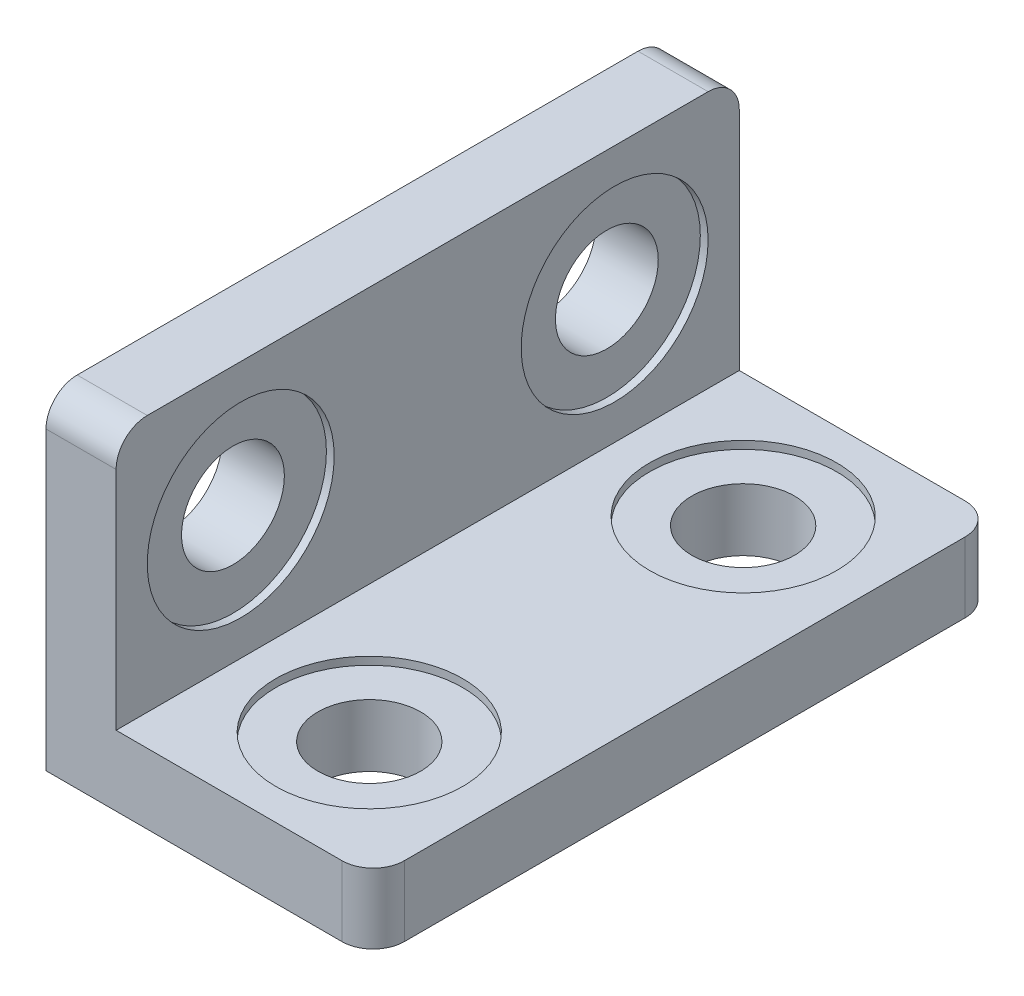
ISO-10303-21;
HEADER;
FILE_DESCRIPTION(('STEP AP214'),'2;1');
FILE_NAME('part.step','',(''),(''),'','','');
FILE_SCHEMA(('AUTOMOTIVE_DESIGN { 1 0 10303 214 1 1 1 1 }'));
ENDSEC;
DATA;
#1=APPLICATION_CONTEXT('core data for automotive mechanical design processes');
#2=APPLICATION_PROTOCOL_DEFINITION('international standard','automotive_design',2000,#1);
#3=PRODUCT_CONTEXT('',#1,'mechanical');
#4=PRODUCT('Part','Part','',(#3));
#5=PRODUCT_RELATED_PRODUCT_CATEGORY('part','',(#4));
#6=PRODUCT_DEFINITION_FORMATION('','',#4);
#7=PRODUCT_DEFINITION_CONTEXT('part definition',#1,'design');
#8=PRODUCT_DEFINITION('design','',#6,#7);
#9=PRODUCT_DEFINITION_SHAPE('','',#8);
#10=(LENGTH_UNIT() NAMED_UNIT(*) SI_UNIT(.MILLI.,.METRE.));
#11=(NAMED_UNIT(*) PLANE_ANGLE_UNIT() SI_UNIT($,.RADIAN.));
#12=(NAMED_UNIT(*) SI_UNIT($,.STERADIAN.) SOLID_ANGLE_UNIT());
#13=UNCERTAINTY_MEASURE_WITH_UNIT(LENGTH_MEASURE(1.E-05),#10,'distance_accuracy_value','');
#14=(GEOMETRIC_REPRESENTATION_CONTEXT(3) GLOBAL_UNCERTAINTY_ASSIGNED_CONTEXT((#13)) GLOBAL_UNIT_ASSIGNED_CONTEXT((#10,
#11,#12)) REPRESENTATION_CONTEXT('',''));
#15=CARTESIAN_POINT('',(0.,0.,0.));
#16=DIRECTION('',(0.,0.,1.));
#17=DIRECTION('',(1.,0.,0.));
#18=AXIS2_PLACEMENT_3D('',#15,#16,#17);
#19=CARTESIAN_POINT('',(4.5,21.,20.));
#20=DIRECTION('',(0.,-1.,0.));
#21=DIRECTION('',(0.,0.,-1.));
#22=AXIS2_PLACEMENT_3D('',#19,#20,#21);
#23=PLANE('',#22);
#24=DIRECTION('',(0.,0.,-1.));
#25=VECTOR('',#24,1.);
#26=CARTESIAN_POINT('',(0.,21.,20.));
#27=LINE('',#26,#25);
#28=CARTESIAN_POINT('',(0.,21.,18.));
#29=VERTEX_POINT('',#28);
#30=CARTESIAN_POINT('',(0.,21.,-18.));
#31=VERTEX_POINT('',#30);
#32=EDGE_CURVE('E134',#29,#31,#27,.T.);
#33=ORIENTED_EDGE('',*,*,#32,.F.);
#34=DIRECTION('',(-1.,0.,0.));
#35=VECTOR('',#34,1.);
#36=CARTESIAN_POINT('',(4.5,21.,18.));
#37=LINE('',#36,#35);
#38=CARTESIAN_POINT('',(4.5,21.,18.));
#39=VERTEX_POINT('',#38);
#40=EDGE_CURVE('E177',#29,#39,#37,.F.);
#41=ORIENTED_EDGE('',*,*,#40,.T.);
#42=DIRECTION('',(0.,0.,-1.));
#43=VECTOR('',#42,1.);
#44=CARTESIAN_POINT('',(4.5,21.,20.));
#45=LINE('',#44,#43);
#46=CARTESIAN_POINT('',(4.5,21.,-18.));
#47=VERTEX_POINT('',#46);
#48=EDGE_CURVE('E147',#39,#47,#45,.T.);
#49=ORIENTED_EDGE('',*,*,#48,.T.);
#50=DIRECTION('',(-1.,0.,0.));
#51=VECTOR('',#50,1.);
#52=CARTESIAN_POINT('',(4.5,21.,-18.));
#53=LINE('',#52,#51);
#54=EDGE_CURVE('E174',#47,#31,#53,.T.);
#55=ORIENTED_EDGE('',*,*,#54,.T.);
#56=EDGE_LOOP('',(#33,#41,#49,#55));
#57=FACE_BOUND('',#56,.T.);
#58=ADVANCED_FACE('F37',(#57),#23,.F.);
#59=CARTESIAN_POINT('',(0.,21.,20.));
#60=DIRECTION('',(1.,0.,0.));
#61=DIRECTION('',(0.,1.,0.));
#62=AXIS2_PLACEMENT_3D('',#59,#60,#61);
#63=PLANE('',#62);
#64=CARTESIAN_POINT('',(0.,12.75,-12.));
#65=DIRECTION('',(1.,0.,0.));
#66=DIRECTION('',(0.,0.,-1.));
#67=AXIS2_PLACEMENT_3D('',#64,#65,#66);
#68=CIRCLE('',#67,3.3);
#69=CARTESIAN_POINT('',(0.,12.75,-15.3));
#70=VERTEX_POINT('',#69);
#71=EDGE_CURVE('E314',#70,#70,#68,.T.);
#72=ORIENTED_EDGE('',*,*,#71,.T.);
#73=EDGE_LOOP('',(#72));
#74=FACE_BOUND('',#73,.T.);
#75=CARTESIAN_POINT('',(0.,12.75,12.));
#76=DIRECTION('',(1.,0.,0.));
#77=DIRECTION('',(0.,0.,-1.));
#78=AXIS2_PLACEMENT_3D('',#75,#76,#77);
#79=CIRCLE('',#78,3.3);
#80=CARTESIAN_POINT('',(0.,12.75,8.7));
#81=VERTEX_POINT('',#80);
#82=EDGE_CURVE('E326',#81,#81,#79,.T.);
#83=ORIENTED_EDGE('',*,*,#82,.T.);
#84=EDGE_LOOP('',(#83));
#85=FACE_BOUND('',#84,.T.);
#86=DIRECTION('',(0.,-1.,0.));
#87=VECTOR('',#86,1.);
#88=CARTESIAN_POINT('',(0.,21.,20.));
#89=LINE('',#88,#87);
#90=CARTESIAN_POINT('',(0.,19.,20.));
#91=VERTEX_POINT('',#90);
#92=CARTESIAN_POINT('',(0.,0.,20.));
#93=VERTEX_POINT('',#92);
#94=EDGE_CURVE('E116',#91,#93,#89,.T.);
#95=ORIENTED_EDGE('',*,*,#94,.F.);
#96=CARTESIAN_POINT('',(0.,19.,18.));
#97=DIRECTION('',(1.,0.,0.));
#98=DIRECTION('',(0.,1.,0.));
#99=AXIS2_PLACEMENT_3D('',#96,#97,#98);
#100=CIRCLE('',#99,2.);
#101=EDGE_CURVE('E172',#91,#29,#100,.F.);
#102=ORIENTED_EDGE('',*,*,#101,.T.);
#103=ORIENTED_EDGE('',*,*,#32,.T.);
#104=CARTESIAN_POINT('',(0.,19.,-18.));
#105=DIRECTION('',(1.,0.,0.));
#106=DIRECTION('',(0.,1.,0.));
#107=AXIS2_PLACEMENT_3D('',#104,#105,#106);
#108=CIRCLE('',#107,2.);
#109=CARTESIAN_POINT('',(0.,19.,-20.));
#110=VERTEX_POINT('',#109);
#111=EDGE_CURVE('E170',#31,#110,#108,.F.);
#112=ORIENTED_EDGE('',*,*,#111,.T.);
#113=DIRECTION('',(0.,-1.,0.));
#114=VECTOR('',#113,1.);
#115=CARTESIAN_POINT('',(0.,21.,-20.));
#116=LINE('',#115,#114);
#117=CARTESIAN_POINT('',(0.,0.,-20.));
#118=VERTEX_POINT('',#117);
#119=EDGE_CURVE('E133',#110,#118,#116,.T.);
#120=ORIENTED_EDGE('',*,*,#119,.T.);
#121=DIRECTION('',(0.,0.,-1.));
#122=VECTOR('',#121,1.);
#123=CARTESIAN_POINT('',(0.,0.,20.));
#124=LINE('',#123,#122);
#125=EDGE_CURVE('E130',#93,#118,#124,.T.);
#126=ORIENTED_EDGE('',*,*,#125,.F.);
#127=EDGE_LOOP('',(#95,#102,#103,#112,#120,#126));
#128=FACE_BOUND('',#127,.T.);
#129=ADVANCED_FACE('F131',(#74,#85,#128),#63,.F.);
#130=CARTESIAN_POINT('',(0.,0.,20.));
#131=DIRECTION('',(0.,1.,0.));
#132=DIRECTION('',(0.,0.,1.));
#133=AXIS2_PLACEMENT_3D('',#130,#131,#132);
#134=PLANE('',#133);
#135=CARTESIAN_POINT('',(12.75,0.,-12.));
#136=DIRECTION('',(0.,1.,0.));
#137=DIRECTION('',(0.,0.,1.));
#138=AXIS2_PLACEMENT_3D('',#135,#136,#137);
#139=CIRCLE('',#138,3.3);
#140=CARTESIAN_POINT('',(12.75,0.,-8.7));
#141=VERTEX_POINT('',#140);
#142=EDGE_CURVE('E338',#141,#141,#139,.T.);
#143=ORIENTED_EDGE('',*,*,#142,.T.);
#144=EDGE_LOOP('',(#143));
#145=FACE_BOUND('',#144,.T.);
#146=CARTESIAN_POINT('',(12.75,0.,12.));
#147=DIRECTION('',(0.,1.,0.));
#148=DIRECTION('',(0.,0.,1.));
#149=AXIS2_PLACEMENT_3D('',#146,#147,#148);
#150=CIRCLE('',#149,3.3);
#151=CARTESIAN_POINT('',(12.75,0.,15.3));
#152=VERTEX_POINT('',#151);
#153=EDGE_CURVE('E150',#152,#152,#150,.T.);
#154=ORIENTED_EDGE('',*,*,#153,.T.);
#155=EDGE_LOOP('',(#154));
#156=FACE_BOUND('',#155,.T.);
#157=DIRECTION('',(0.,0.,-1.));
#158=VECTOR('',#157,1.);
#159=CARTESIAN_POINT('',(21.,0.,20.));
#160=LINE('',#159,#158);
#161=CARTESIAN_POINT('',(21.,0.,18.));
#162=VERTEX_POINT('',#161);
#163=CARTESIAN_POINT('',(21.,0.,-18.));
#164=VERTEX_POINT('',#163);
#165=EDGE_CURVE('E135',#162,#164,#160,.T.);
#166=ORIENTED_EDGE('',*,*,#165,.F.);
#167=CARTESIAN_POINT('',(19.,0.,18.));
#168=DIRECTION('',(0.,1.,0.));
#169=DIRECTION('',(0.,0.,1.));
#170=AXIS2_PLACEMENT_3D('',#167,#168,#169);
#171=CIRCLE('',#170,2.);
#172=CARTESIAN_POINT('',(19.,0.,20.));
#173=VERTEX_POINT('',#172);
#174=EDGE_CURVE('E139',#162,#173,#171,.F.);
#175=ORIENTED_EDGE('',*,*,#174,.T.);
#176=DIRECTION('',(1.,0.,0.));
#177=VECTOR('',#176,1.);
#178=CARTESIAN_POINT('',(0.,0.,20.));
#179=LINE('',#178,#177);
#180=EDGE_CURVE('E122',#93,#173,#179,.T.);
#181=ORIENTED_EDGE('',*,*,#180,.F.);
#182=ORIENTED_EDGE('',*,*,#125,.T.);
#183=DIRECTION('',(1.,0.,0.));
#184=VECTOR('',#183,1.);
#185=CARTESIAN_POINT('',(0.,0.,-20.));
#186=LINE('',#185,#184);
#187=CARTESIAN_POINT('',(19.,0.,-20.));
#188=VERTEX_POINT('',#187);
#189=EDGE_CURVE('E149',#118,#188,#186,.T.);
#190=ORIENTED_EDGE('',*,*,#189,.T.);
#191=CARTESIAN_POINT('',(19.,0.,-18.));
#192=DIRECTION('',(0.,1.,0.));
#193=DIRECTION('',(0.,0.,1.));
#194=AXIS2_PLACEMENT_3D('',#191,#192,#193);
#195=CIRCLE('',#194,2.);
#196=EDGE_CURVE('E57',#188,#164,#195,.F.);
#197=ORIENTED_EDGE('',*,*,#196,.T.);
#198=EDGE_LOOP('',(#166,#175,#181,#182,#190,#197));
#199=FACE_BOUND('',#198,.T.);
#200=ADVANCED_FACE('F137',(#145,#156,#199),#134,.F.);
#201=CARTESIAN_POINT('',(21.,0.,20.));
#202=DIRECTION('',(-1.,0.,0.));
#203=DIRECTION('',(0.,0.,1.));
#204=AXIS2_PLACEMENT_3D('',#201,#202,#203);
#205=PLANE('',#204);
#206=DIRECTION('',(0.,0.,-1.));
#207=VECTOR('',#206,1.);
#208=CARTESIAN_POINT('',(21.,4.5,20.));
#209=LINE('',#208,#207);
#210=CARTESIAN_POINT('',(21.,4.5,18.));
#211=VERTEX_POINT('',#210);
#212=CARTESIAN_POINT('',(21.,4.5,-18.));
#213=VERTEX_POINT('',#212);
#214=EDGE_CURVE('E161',#211,#213,#209,.T.);
#215=ORIENTED_EDGE('',*,*,#214,.F.);
#216=DIRECTION('',(0.,1.,0.));
#217=VECTOR('',#216,1.);
#218=CARTESIAN_POINT('',(21.,0.,18.));
#219=LINE('',#218,#217);
#220=EDGE_CURVE('E190',#211,#162,#219,.F.);
#221=ORIENTED_EDGE('',*,*,#220,.T.);
#222=ORIENTED_EDGE('',*,*,#165,.T.);
#223=DIRECTION('',(0.,1.,0.));
#224=VECTOR('',#223,1.);
#225=CARTESIAN_POINT('',(21.,0.,-18.));
#226=LINE('',#225,#224);
#227=EDGE_CURVE('E187',#164,#213,#226,.T.);
#228=ORIENTED_EDGE('',*,*,#227,.T.);
#229=EDGE_LOOP('',(#215,#221,#222,#228));
#230=FACE_BOUND('',#229,.T.);
#231=ADVANCED_FACE('F218',(#230),#205,.F.);
#232=CARTESIAN_POINT('',(21.,4.5,20.));
#233=DIRECTION('',(0.,-1.,0.));
#234=DIRECTION('',(1.,0.,0.));
#235=AXIS2_PLACEMENT_3D('',#232,#233,#234);
#236=PLANE('',#235);
#237=CARTESIAN_POINT('',(12.75,4.5,-12.));
#238=DIRECTION('',(0.,1.,0.));
#239=DIRECTION('',(0.,0.,1.));
#240=AXIS2_PLACEMENT_3D('',#237,#238,#239);
#241=CIRCLE('',#240,6.);
#242=CARTESIAN_POINT('',(12.75,4.5,-6.));
#243=VERTEX_POINT('',#242);
#244=EDGE_CURVE('E329',#243,#243,#241,.T.);
#245=ORIENTED_EDGE('',*,*,#244,.F.);
#246=EDGE_LOOP('',(#245));
#247=FACE_BOUND('',#246,.T.);
#248=CARTESIAN_POINT('',(12.75,4.5,12.));
#249=DIRECTION('',(0.,1.,0.));
#250=DIRECTION('',(0.,0.,1.));
#251=AXIS2_PLACEMENT_3D('',#248,#249,#250);
#252=CIRCLE('',#251,6.);
#253=CARTESIAN_POINT('',(12.75,4.5,18.));
#254=VERTEX_POINT('',#253);
#255=EDGE_CURVE('E341',#254,#254,#252,.T.);
#256=ORIENTED_EDGE('',*,*,#255,.F.);
#257=EDGE_LOOP('',(#256));
#258=FACE_BOUND('',#257,.T.);
#259=DIRECTION('',(-1.,0.,0.));
#260=VECTOR('',#259,1.);
#261=CARTESIAN_POINT('',(21.,4.5,20.));
#262=LINE('',#261,#260);
#263=CARTESIAN_POINT('',(19.,4.5,20.));
#264=VERTEX_POINT('',#263);
#265=CARTESIAN_POINT('',(4.5,4.5,20.));
#266=VERTEX_POINT('',#265);
#267=EDGE_CURVE('E140',#264,#266,#262,.T.);
#268=ORIENTED_EDGE('',*,*,#267,.F.);
#269=CARTESIAN_POINT('',(19.,4.5,18.));
#270=DIRECTION('',(0.,-1.,0.));
#271=DIRECTION('',(1.,0.,0.));
#272=AXIS2_PLACEMENT_3D('',#269,#270,#271);
#273=CIRCLE('',#272,2.);
#274=EDGE_CURVE('E185',#264,#211,#273,.F.);
#275=ORIENTED_EDGE('',*,*,#274,.T.);
#276=ORIENTED_EDGE('',*,*,#214,.T.);
#277=CARTESIAN_POINT('',(19.,4.5,-18.));
#278=DIRECTION('',(0.,-1.,0.));
#279=DIRECTION('',(1.,0.,0.));
#280=AXIS2_PLACEMENT_3D('',#277,#278,#279);
#281=CIRCLE('',#280,2.);
#282=CARTESIAN_POINT('',(19.,4.5,-20.));
#283=VERTEX_POINT('',#282);
#284=EDGE_CURVE('E183',#213,#283,#281,.F.);
#285=ORIENTED_EDGE('',*,*,#284,.T.);
#286=DIRECTION('',(-1.,0.,0.));
#287=VECTOR('',#286,1.);
#288=CARTESIAN_POINT('',(21.,4.5,-20.));
#289=LINE('',#288,#287);
#290=CARTESIAN_POINT('',(4.5,4.5,-20.));
#291=VERTEX_POINT('',#290);
#292=EDGE_CURVE('E152',#283,#291,#289,.T.);
#293=ORIENTED_EDGE('',*,*,#292,.T.);
#294=DIRECTION('',(0.,0.,-1.));
#295=VECTOR('',#294,1.);
#296=CARTESIAN_POINT('',(4.5,4.5,20.));
#297=LINE('',#296,#295);
#298=EDGE_CURVE('E158',#266,#291,#297,.T.);
#299=ORIENTED_EDGE('',*,*,#298,.F.);
#300=EDGE_LOOP('',(#268,#275,#276,#285,#293,#299));
#301=FACE_BOUND('',#300,.T.);
#302=ADVANCED_FACE('F212',(#247,#258,#301),#236,.F.);
#303=CARTESIAN_POINT('',(4.5,4.5,20.));
#304=DIRECTION('',(-1.,0.,0.));
#305=DIRECTION('',(0.,0.,1.));
#306=AXIS2_PLACEMENT_3D('',#303,#304,#305);
#307=PLANE('',#306);
#308=CARTESIAN_POINT('',(4.5,12.75,-12.));
#309=DIRECTION('',(1.,0.,0.));
#310=DIRECTION('',(0.,0.,-1.));
#311=AXIS2_PLACEMENT_3D('',#308,#309,#310);
#312=CIRCLE('',#311,6.);
#313=CARTESIAN_POINT('',(4.5,12.75,-18.));
#314=VERTEX_POINT('',#313);
#315=EDGE_CURVE('E307',#314,#314,#312,.T.);
#316=ORIENTED_EDGE('',*,*,#315,.F.);
#317=EDGE_LOOP('',(#316));
#318=FACE_BOUND('',#317,.T.);
#319=CARTESIAN_POINT('',(4.5,12.75,12.));
#320=DIRECTION('',(1.,0.,0.));
#321=DIRECTION('',(0.,0.,-1.));
#322=AXIS2_PLACEMENT_3D('',#319,#320,#321);
#323=CIRCLE('',#322,6.);
#324=CARTESIAN_POINT('',(4.5,12.75,6.));
#325=VERTEX_POINT('',#324);
#326=EDGE_CURVE('E317',#325,#325,#323,.T.);
#327=ORIENTED_EDGE('',*,*,#326,.F.);
#328=EDGE_LOOP('',(#327));
#329=FACE_BOUND('',#328,.T.);
#330=ORIENTED_EDGE('',*,*,#48,.F.);
#331=CARTESIAN_POINT('',(4.5,19.,18.));
#332=DIRECTION('',(-1.,0.,0.));
#333=DIRECTION('',(0.,0.,1.));
#334=AXIS2_PLACEMENT_3D('',#331,#332,#333);
#335=CIRCLE('',#334,2.);
#336=CARTESIAN_POINT('',(4.5,19.,20.));
#337=VERTEX_POINT('',#336);
#338=EDGE_CURVE('E181',#39,#337,#335,.F.);
#339=ORIENTED_EDGE('',*,*,#338,.T.);
#340=DIRECTION('',(0.,1.,0.));
#341=VECTOR('',#340,1.);
#342=CARTESIAN_POINT('',(4.5,4.5,20.));
#343=LINE('',#342,#341);
#344=EDGE_CURVE('E142',#266,#337,#343,.T.);
#345=ORIENTED_EDGE('',*,*,#344,.F.);
#346=ORIENTED_EDGE('',*,*,#298,.T.);
#347=DIRECTION('',(0.,1.,0.));
#348=VECTOR('',#347,1.);
#349=CARTESIAN_POINT('',(4.5,4.5,-20.));
#350=LINE('',#349,#348);
#351=CARTESIAN_POINT('',(4.5,19.,-20.));
#352=VERTEX_POINT('',#351);
#353=EDGE_CURVE('E127',#291,#352,#350,.T.);
#354=ORIENTED_EDGE('',*,*,#353,.T.);
#355=CARTESIAN_POINT('',(4.5,19.,-18.));
#356=DIRECTION('',(-1.,0.,0.));
#357=DIRECTION('',(0.,0.,1.));
#358=AXIS2_PLACEMENT_3D('',#355,#356,#357);
#359=CIRCLE('',#358,2.);
#360=EDGE_CURVE('E179',#352,#47,#359,.F.);
#361=ORIENTED_EDGE('',*,*,#360,.T.);
#362=EDGE_LOOP('',(#330,#339,#345,#346,#354,#361));
#363=FACE_BOUND('',#362,.T.);
#364=ADVANCED_FACE('F200',(#318,#329,#363),#307,.F.);
#365=CARTESIAN_POINT('',(0.,0.,20.));
#366=DIRECTION('',(0.,0.,1.));
#367=DIRECTION('',(1.,0.,0.));
#368=AXIS2_PLACEMENT_3D('',#365,#366,#367);
#369=PLANE('',#368);
#370=ORIENTED_EDGE('',*,*,#344,.T.);
#371=DIRECTION('',(-1.,0.,0.));
#372=VECTOR('',#371,1.);
#373=CARTESIAN_POINT('',(0.,19.,20.));
#374=LINE('',#373,#372);
#375=EDGE_CURVE('E125',#337,#91,#374,.T.);
#376=ORIENTED_EDGE('',*,*,#375,.T.);
#377=ORIENTED_EDGE('',*,*,#94,.T.);
#378=ORIENTED_EDGE('',*,*,#180,.T.);
#379=DIRECTION('',(0.,1.,0.));
#380=VECTOR('',#379,1.);
#381=CARTESIAN_POINT('',(19.,4.5,20.));
#382=LINE('',#381,#380);
#383=EDGE_CURVE('E167',#173,#264,#382,.T.);
#384=ORIENTED_EDGE('',*,*,#383,.T.);
#385=ORIENTED_EDGE('',*,*,#267,.T.);
#386=EDGE_LOOP('',(#370,#376,#377,#378,#384,#385));
#387=FACE_BOUND('',#386,.T.);
#388=ADVANCED_FACE('F119',(#387),#369,.T.);
#389=CARTESIAN_POINT('',(0.,0.,-20.));
#390=DIRECTION('',(0.,0.,1.));
#391=DIRECTION('',(1.,0.,0.));
#392=AXIS2_PLACEMENT_3D('',#389,#390,#391);
#393=PLANE('',#392);
#394=ORIENTED_EDGE('',*,*,#292,.F.);
#395=DIRECTION('',(0.,1.,0.));
#396=VECTOR('',#395,1.);
#397=CARTESIAN_POINT('',(19.,0.,-20.));
#398=LINE('',#397,#396);
#399=EDGE_CURVE('E11',#283,#188,#398,.F.);
#400=ORIENTED_EDGE('',*,*,#399,.T.);
#401=ORIENTED_EDGE('',*,*,#189,.F.);
#402=ORIENTED_EDGE('',*,*,#119,.F.);
#403=DIRECTION('',(-1.,0.,0.));
#404=VECTOR('',#403,1.);
#405=CARTESIAN_POINT('',(0.,19.,-20.));
#406=LINE('',#405,#404);
#407=EDGE_CURVE('E45',#110,#352,#406,.F.);
#408=ORIENTED_EDGE('',*,*,#407,.T.);
#409=ORIENTED_EDGE('',*,*,#353,.F.);
#410=EDGE_LOOP('',(#394,#400,#401,#402,#408,#409));
#411=FACE_BOUND('',#410,.T.);
#412=ADVANCED_FACE('F195',(#411),#393,.F.);
#413=CARTESIAN_POINT('',(12.75,4.5,12.));
#414=DIRECTION('',(0.,1.,0.));
#415=DIRECTION('',(0.,0.,1.));
#416=AXIS2_PLACEMENT_3D('',#413,#414,#415);
#417=CYLINDRICAL_SURFACE('',#416,3.3);
#418=ORIENTED_EDGE('',*,*,#153,.F.);
#419=EDGE_LOOP('',(#418));
#420=FACE_BOUND('',#419,.T.);
#421=CARTESIAN_POINT('',(12.75,4.,12.));
#422=DIRECTION('',(0.,1.,0.));
#423=DIRECTION('',(0.,0.,1.));
#424=AXIS2_PLACEMENT_3D('',#421,#422,#423);
#425=CIRCLE('',#424,3.3);
#426=CARTESIAN_POINT('',(12.75,4.,15.3));
#427=VERTEX_POINT('',#426);
#428=EDGE_CURVE('E347',#427,#427,#425,.T.);
#429=ORIENTED_EDGE('',*,*,#428,.T.);
#430=EDGE_LOOP('',(#429));
#431=FACE_BOUND('',#430,.T.);
#432=ADVANCED_FACE('F252',(#420,#431),#417,.F.);
#433=CARTESIAN_POINT('',(16.05,4.,12.));
#434=DIRECTION('',(0.,-1.,0.));
#435=DIRECTION('',(0.,0.,-1.));
#436=AXIS2_PLACEMENT_3D('',#433,#434,#435);
#437=PLANE('',#436);
#438=ORIENTED_EDGE('',*,*,#428,.F.);
#439=EDGE_LOOP('',(#438));
#440=FACE_BOUND('',#439,.T.);
#441=CARTESIAN_POINT('',(12.75,4.,12.));
#442=DIRECTION('',(0.,1.,0.));
#443=DIRECTION('',(0.,0.,1.));
#444=AXIS2_PLACEMENT_3D('',#441,#442,#443);
#445=CIRCLE('',#444,6.);
#446=CARTESIAN_POINT('',(12.75,4.,18.));
#447=VERTEX_POINT('',#446);
#448=EDGE_CURVE('E344',#447,#447,#445,.T.);
#449=ORIENTED_EDGE('',*,*,#448,.T.);
#450=EDGE_LOOP('',(#449));
#451=FACE_BOUND('',#450,.T.);
#452=ADVANCED_FACE('F257',(#440,#451),#437,.F.);
#453=CARTESIAN_POINT('',(12.75,4.5,12.));
#454=DIRECTION('',(0.,1.,0.));
#455=DIRECTION('',(0.,0.,1.));
#456=AXIS2_PLACEMENT_3D('',#453,#454,#455);
#457=CYLINDRICAL_SURFACE('',#456,6.);
#458=ORIENTED_EDGE('',*,*,#448,.F.);
#459=EDGE_LOOP('',(#458));
#460=FACE_BOUND('',#459,.T.);
#461=ORIENTED_EDGE('',*,*,#255,.T.);
#462=EDGE_LOOP('',(#461));
#463=FACE_BOUND('',#462,.T.);
#464=ADVANCED_FACE('F261',(#460,#463),#457,.F.);
#465=CARTESIAN_POINT('',(12.75,4.5,-12.));
#466=DIRECTION('',(0.,1.,0.));
#467=DIRECTION('',(0.,0.,1.));
#468=AXIS2_PLACEMENT_3D('',#465,#466,#467);
#469=CYLINDRICAL_SURFACE('',#468,3.3);
#470=ORIENTED_EDGE('',*,*,#142,.F.);
#471=EDGE_LOOP('',(#470));
#472=FACE_BOUND('',#471,.T.);
#473=CARTESIAN_POINT('',(12.75,4.,-12.));
#474=DIRECTION('',(0.,1.,0.));
#475=DIRECTION('',(0.,0.,1.));
#476=AXIS2_PLACEMENT_3D('',#473,#474,#475);
#477=CIRCLE('',#476,3.3);
#478=CARTESIAN_POINT('',(12.75,4.,-8.7));
#479=VERTEX_POINT('',#478);
#480=EDGE_CURVE('E335',#479,#479,#477,.T.);
#481=ORIENTED_EDGE('',*,*,#480,.T.);
#482=EDGE_LOOP('',(#481));
#483=FACE_BOUND('',#482,.T.);
#484=ADVANCED_FACE('F265',(#472,#483),#469,.F.);
#485=CARTESIAN_POINT('',(16.05,4.,-12.));
#486=DIRECTION('',(0.,-1.,0.));
#487=DIRECTION('',(0.,0.,-1.));
#488=AXIS2_PLACEMENT_3D('',#485,#486,#487);
#489=PLANE('',#488);
#490=ORIENTED_EDGE('',*,*,#480,.F.);
#491=EDGE_LOOP('',(#490));
#492=FACE_BOUND('',#491,.T.);
#493=CARTESIAN_POINT('',(12.75,4.,-12.));
#494=DIRECTION('',(0.,1.,0.));
#495=DIRECTION('',(0.,0.,1.));
#496=AXIS2_PLACEMENT_3D('',#493,#494,#495);
#497=CIRCLE('',#496,6.);
#498=CARTESIAN_POINT('',(12.75,4.,-6.));
#499=VERTEX_POINT('',#498);
#500=EDGE_CURVE('E332',#499,#499,#497,.T.);
#501=ORIENTED_EDGE('',*,*,#500,.T.);
#502=EDGE_LOOP('',(#501));
#503=FACE_BOUND('',#502,.T.);
#504=ADVANCED_FACE('F269',(#492,#503),#489,.F.);
#505=CARTESIAN_POINT('',(12.75,4.5,-12.));
#506=DIRECTION('',(0.,1.,0.));
#507=DIRECTION('',(0.,0.,1.));
#508=AXIS2_PLACEMENT_3D('',#505,#506,#507);
#509=CYLINDRICAL_SURFACE('',#508,6.);
#510=ORIENTED_EDGE('',*,*,#500,.F.);
#511=EDGE_LOOP('',(#510));
#512=FACE_BOUND('',#511,.T.);
#513=ORIENTED_EDGE('',*,*,#244,.T.);
#514=EDGE_LOOP('',(#513));
#515=FACE_BOUND('',#514,.T.);
#516=ADVANCED_FACE('F273',(#512,#515),#509,.F.);
#517=CARTESIAN_POINT('',(4.5,12.75,12.));
#518=DIRECTION('',(1.,0.,0.));
#519=DIRECTION('',(0.,0.,-1.));
#520=AXIS2_PLACEMENT_3D('',#517,#518,#519);
#521=CYLINDRICAL_SURFACE('',#520,3.3);
#522=ORIENTED_EDGE('',*,*,#82,.F.);
#523=EDGE_LOOP('',(#522));
#524=FACE_BOUND('',#523,.T.);
#525=CARTESIAN_POINT('',(4.,12.75,12.));
#526=DIRECTION('',(1.,0.,0.));
#527=DIRECTION('',(0.,0.,-1.));
#528=AXIS2_PLACEMENT_3D('',#525,#526,#527);
#529=CIRCLE('',#528,3.3);
#530=CARTESIAN_POINT('',(4.,12.75,8.7));
#531=VERTEX_POINT('',#530);
#532=EDGE_CURVE('E323',#531,#531,#529,.T.);
#533=ORIENTED_EDGE('',*,*,#532,.T.);
#534=EDGE_LOOP('',(#533));
#535=FACE_BOUND('',#534,.T.);
#536=ADVANCED_FACE('F277',(#524,#535),#521,.F.);
#537=CARTESIAN_POINT('',(4.,16.05,12.));
#538=DIRECTION('',(-1.,0.,0.));
#539=DIRECTION('',(0.,0.,1.));
#540=AXIS2_PLACEMENT_3D('',#537,#538,#539);
#541=PLANE('',#540);
#542=ORIENTED_EDGE('',*,*,#532,.F.);
#543=EDGE_LOOP('',(#542));
#544=FACE_BOUND('',#543,.T.);
#545=CARTESIAN_POINT('',(4.,12.75,12.));
#546=DIRECTION('',(1.,0.,0.));
#547=DIRECTION('',(0.,0.,-1.));
#548=AXIS2_PLACEMENT_3D('',#545,#546,#547);
#549=CIRCLE('',#548,6.);
#550=CARTESIAN_POINT('',(4.,12.75,6.));
#551=VERTEX_POINT('',#550);
#552=EDGE_CURVE('E320',#551,#551,#549,.T.);
#553=ORIENTED_EDGE('',*,*,#552,.T.);
#554=EDGE_LOOP('',(#553));
#555=FACE_BOUND('',#554,.T.);
#556=ADVANCED_FACE('F281',(#544,#555),#541,.F.);
#557=CARTESIAN_POINT('',(4.5,12.75,12.));
#558=DIRECTION('',(1.,0.,0.));
#559=DIRECTION('',(0.,0.,-1.));
#560=AXIS2_PLACEMENT_3D('',#557,#558,#559);
#561=CYLINDRICAL_SURFACE('',#560,6.);
#562=ORIENTED_EDGE('',*,*,#552,.F.);
#563=EDGE_LOOP('',(#562));
#564=FACE_BOUND('',#563,.T.);
#565=ORIENTED_EDGE('',*,*,#326,.T.);
#566=EDGE_LOOP('',(#565));
#567=FACE_BOUND('',#566,.T.);
#568=ADVANCED_FACE('F285',(#564,#567),#561,.F.);
#569=CARTESIAN_POINT('',(4.5,12.75,-12.));
#570=DIRECTION('',(1.,0.,0.));
#571=DIRECTION('',(0.,0.,-1.));
#572=AXIS2_PLACEMENT_3D('',#569,#570,#571);
#573=CYLINDRICAL_SURFACE('',#572,3.3);
#574=ORIENTED_EDGE('',*,*,#71,.F.);
#575=EDGE_LOOP('',(#574));
#576=FACE_BOUND('',#575,.T.);
#577=CARTESIAN_POINT('',(4.,12.75,-12.));
#578=DIRECTION('',(1.,0.,0.));
#579=DIRECTION('',(0.,0.,-1.));
#580=AXIS2_PLACEMENT_3D('',#577,#578,#579);
#581=CIRCLE('',#580,3.3);
#582=CARTESIAN_POINT('',(4.,12.75,-15.3));
#583=VERTEX_POINT('',#582);
#584=EDGE_CURVE('E309',#583,#583,#581,.T.);
#585=ORIENTED_EDGE('',*,*,#584,.T.);
#586=EDGE_LOOP('',(#585));
#587=FACE_BOUND('',#586,.T.);
#588=ADVANCED_FACE('F289',(#576,#587),#573,.F.);
#589=CARTESIAN_POINT('',(4.,16.05,-12.));
#590=DIRECTION('',(-1.,0.,0.));
#591=DIRECTION('',(0.,0.,1.));
#592=AXIS2_PLACEMENT_3D('',#589,#590,#591);
#593=PLANE('',#592);
#594=ORIENTED_EDGE('',*,*,#584,.F.);
#595=EDGE_LOOP('',(#594));
#596=FACE_BOUND('',#595,.T.);
#597=CARTESIAN_POINT('',(4.,12.75,-12.));
#598=DIRECTION('',(1.,0.,0.));
#599=DIRECTION('',(0.,0.,-1.));
#600=AXIS2_PLACEMENT_3D('',#597,#598,#599);
#601=CIRCLE('',#600,6.);
#602=CARTESIAN_POINT('',(4.,12.75,-18.));
#603=VERTEX_POINT('',#602);
#604=EDGE_CURVE('E304',#603,#603,#601,.T.);
#605=ORIENTED_EDGE('',*,*,#604,.T.);
#606=EDGE_LOOP('',(#605));
#607=FACE_BOUND('',#606,.T.);
#608=ADVANCED_FACE('F293',(#596,#607),#593,.F.);
#609=CARTESIAN_POINT('',(4.5,12.75,-12.));
#610=DIRECTION('',(1.,0.,0.));
#611=DIRECTION('',(0.,0.,-1.));
#612=AXIS2_PLACEMENT_3D('',#609,#610,#611);
#613=CYLINDRICAL_SURFACE('',#612,6.);
#614=ORIENTED_EDGE('',*,*,#604,.F.);
#615=EDGE_LOOP('',(#614));
#616=FACE_BOUND('',#615,.T.);
#617=ORIENTED_EDGE('',*,*,#315,.T.);
#618=EDGE_LOOP('',(#617));
#619=FACE_BOUND('',#618,.T.);
#620=ADVANCED_FACE('F228',(#616,#619),#613,.F.);
#621=CARTESIAN_POINT('',(0.,19.,18.));
#622=DIRECTION('',(1.,0.,0.));
#623=DIRECTION('',(0.,0.,-1.));
#624=AXIS2_PLACEMENT_3D('',#621,#622,#623);
#625=CYLINDRICAL_SURFACE('',#624,2.);
#626=ORIENTED_EDGE('',*,*,#338,.F.);
#627=ORIENTED_EDGE('',*,*,#40,.F.);
#628=ORIENTED_EDGE('',*,*,#101,.F.);
#629=ORIENTED_EDGE('',*,*,#375,.F.);
#630=EDGE_LOOP('',(#626,#627,#628,#629));
#631=FACE_BOUND('',#630,.T.);
#632=ADVANCED_FACE('F209',(#631),#625,.T.);
#633=CARTESIAN_POINT('',(19.,0.,18.));
#634=DIRECTION('',(0.,-1.,0.));
#635=DIRECTION('',(0.,0.,-1.));
#636=AXIS2_PLACEMENT_3D('',#633,#634,#635);
#637=CYLINDRICAL_SURFACE('',#636,2.);
#638=ORIENTED_EDGE('',*,*,#174,.F.);
#639=ORIENTED_EDGE('',*,*,#220,.F.);
#640=ORIENTED_EDGE('',*,*,#274,.F.);
#641=ORIENTED_EDGE('',*,*,#383,.F.);
#642=EDGE_LOOP('',(#638,#639,#640,#641));
#643=FACE_BOUND('',#642,.T.);
#644=ADVANCED_FACE('F221',(#643),#637,.T.);
#645=CARTESIAN_POINT('',(19.,0.,-18.));
#646=DIRECTION('',(0.,1.,0.));
#647=DIRECTION('',(0.,0.,1.));
#648=AXIS2_PLACEMENT_3D('',#645,#646,#647);
#649=CYLINDRICAL_SURFACE('',#648,2.);
#650=ORIENTED_EDGE('',*,*,#196,.F.);
#651=ORIENTED_EDGE('',*,*,#399,.F.);
#652=ORIENTED_EDGE('',*,*,#284,.F.);
#653=ORIENTED_EDGE('',*,*,#227,.F.);
#654=EDGE_LOOP('',(#650,#651,#652,#653));
#655=FACE_BOUND('',#654,.T.);
#656=ADVANCED_FACE('F214',(#655),#649,.T.);
#657=CARTESIAN_POINT('',(4.5,19.,-18.));
#658=DIRECTION('',(-1.,0.,0.));
#659=DIRECTION('',(0.,0.,1.));
#660=AXIS2_PLACEMENT_3D('',#657,#658,#659);
#661=CYLINDRICAL_SURFACE('',#660,2.);
#662=ORIENTED_EDGE('',*,*,#360,.F.);
#663=ORIENTED_EDGE('',*,*,#407,.F.);
#664=ORIENTED_EDGE('',*,*,#111,.F.);
#665=ORIENTED_EDGE('',*,*,#54,.F.);
#666=EDGE_LOOP('',(#662,#663,#664,#665));
#667=FACE_BOUND('',#666,.T.);
#668=ADVANCED_FACE('F39',(#667),#661,.T.);
#669=CLOSED_SHELL('',(#58,#129,#200,#231,#302,#364,#388,#412,#432,#452,#464,#484,#504,#516,#536,
#556,#568,#588,#608,#620,#632,#644,#656,#668));
#670=MANIFOLD_SOLID_BREP('B2',#669);
#671=ADVANCED_BREP_SHAPE_REPRESENTATION('',(#18,#670),#14);
#672=SHAPE_DEFINITION_REPRESENTATION(#9,#671);
ENDSEC;
END-ISO-10303-21;
